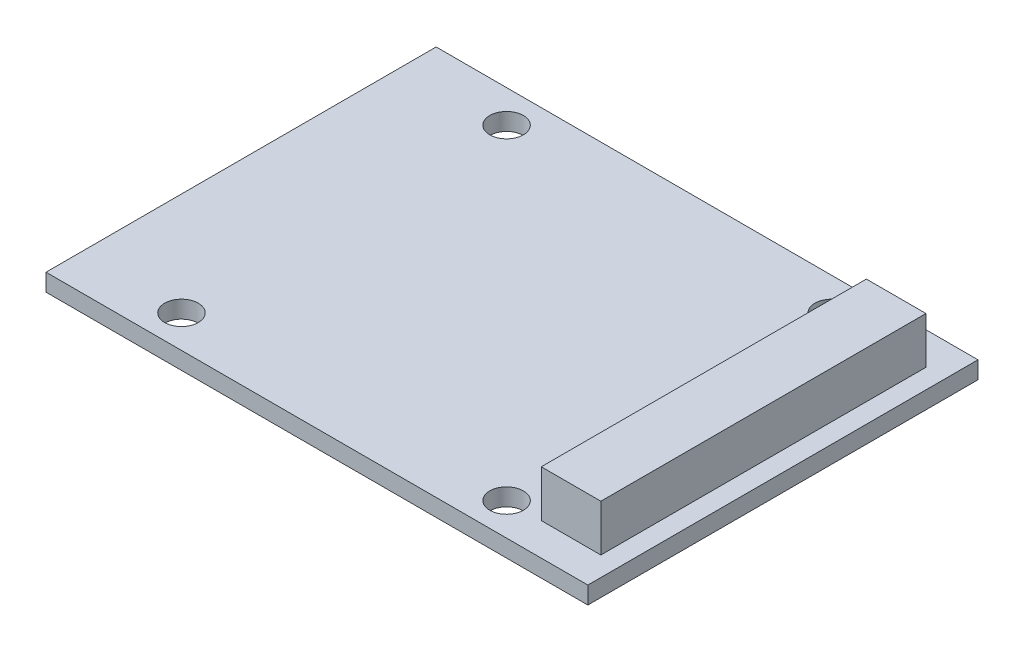
ISO-10303-21;
HEADER;
FILE_DESCRIPTION(('STEP AP214'),'2;1');
FILE_NAME('part.step','',(''),(''),'','','');
FILE_SCHEMA(('AUTOMOTIVE_DESIGN { 1 0 10303 214 1 1 1 1 }'));
ENDSEC;
DATA;
#1=APPLICATION_CONTEXT('core data for automotive mechanical design processes');
#2=APPLICATION_PROTOCOL_DEFINITION('international standard','automotive_design',2000,#1);
#3=PRODUCT_CONTEXT('',#1,'mechanical');
#4=PRODUCT('Part','Part','',(#3));
#5=PRODUCT_RELATED_PRODUCT_CATEGORY('part','',(#4));
#6=PRODUCT_DEFINITION_FORMATION('','',#4);
#7=PRODUCT_DEFINITION_CONTEXT('part definition',#1,'design');
#8=PRODUCT_DEFINITION('design','',#6,#7);
#9=PRODUCT_DEFINITION_SHAPE('','',#8);
#10=(LENGTH_UNIT() NAMED_UNIT(*) SI_UNIT(.MILLI.,.METRE.));
#11=(NAMED_UNIT(*) PLANE_ANGLE_UNIT() SI_UNIT($,.RADIAN.));
#12=(NAMED_UNIT(*) SI_UNIT($,.STERADIAN.) SOLID_ANGLE_UNIT());
#13=UNCERTAINTY_MEASURE_WITH_UNIT(LENGTH_MEASURE(1.E-05),#10,'distance_accuracy_value','');
#14=(GEOMETRIC_REPRESENTATION_CONTEXT(3) GLOBAL_UNCERTAINTY_ASSIGNED_CONTEXT((#13)) GLOBAL_UNIT_ASSIGNED_CONTEXT((#10,
#11,#12)) REPRESENTATION_CONTEXT('',''));
#15=CARTESIAN_POINT('',(0.,0.,0.));
#16=DIRECTION('',(0.,0.,1.));
#17=DIRECTION('',(1.,0.,0.));
#18=AXIS2_PLACEMENT_3D('',#15,#16,#17);
#19=CARTESIAN_POINT('',(0.,1.6,0.));
#20=DIRECTION('',(0.,-1.,0.));
#21=DIRECTION('',(0.,0.,-1.));
#22=AXIS2_PLACEMENT_3D('',#19,#20,#21);
#23=PLANE('',#22);
#24=CARTESIAN_POINT('',(14.5,1.6,15.));
#25=DIRECTION('',(0.,1.,0.));
#26=DIRECTION('',(0.,0.,-1.));
#27=AXIS2_PLACEMENT_3D('',#24,#25,#26);
#28=CIRCLE('',#27,1.55);
#29=CARTESIAN_POINT('',(14.5,1.6,13.45));
#30=VERTEX_POINT('',#29);
#31=EDGE_CURVE('E123',#30,#30,#28,.T.);
#32=ORIENTED_EDGE('',*,*,#31,.F.);
#33=EDGE_LOOP('',(#32));
#34=FACE_BOUND('',#33,.T.);
#35=CARTESIAN_POINT('',(-15.5,1.6,15.));
#36=DIRECTION('',(0.,1.,0.));
#37=DIRECTION('',(0.,0.,-1.));
#38=AXIS2_PLACEMENT_3D('',#35,#36,#37);
#39=CIRCLE('',#38,1.55);
#40=CARTESIAN_POINT('',(-15.5,1.6,13.45));
#41=VERTEX_POINT('',#40);
#42=EDGE_CURVE('E138',#41,#41,#39,.T.);
#43=ORIENTED_EDGE('',*,*,#42,.F.);
#44=EDGE_LOOP('',(#43));
#45=FACE_BOUND('',#44,.T.);
#46=DIRECTION('',(0.,0.,1.));
#47=VECTOR('',#46,1.);
#48=CARTESIAN_POINT('',(-25.,1.6,-18.));
#49=LINE('',#48,#47);
#50=CARTESIAN_POINT('',(-25.,1.6,-18.));
#51=VERTEX_POINT('',#50);
#52=CARTESIAN_POINT('',(-25.,1.6,18.));
#53=VERTEX_POINT('',#52);
#54=EDGE_CURVE('E150',#51,#53,#49,.T.);
#55=ORIENTED_EDGE('',*,*,#54,.T.);
#56=DIRECTION('',(1.,0.,0.));
#57=VECTOR('',#56,1.);
#58=CARTESIAN_POINT('',(25.,1.6,18.));
#59=LINE('',#58,#57);
#60=CARTESIAN_POINT('',(25.,1.6,18.));
#61=VERTEX_POINT('',#60);
#62=EDGE_CURVE('E153',#53,#61,#59,.T.);
#63=ORIENTED_EDGE('',*,*,#62,.T.);
#64=DIRECTION('',(0.,0.,-1.));
#65=VECTOR('',#64,1.);
#66=CARTESIAN_POINT('',(25.,1.6,-18.));
#67=LINE('',#66,#65);
#68=CARTESIAN_POINT('',(25.,1.6,-18.));
#69=VERTEX_POINT('',#68);
#70=EDGE_CURVE('E156',#61,#69,#67,.T.);
#71=ORIENTED_EDGE('',*,*,#70,.T.);
#72=DIRECTION('',(-1.,0.,0.));
#73=VECTOR('',#72,1.);
#74=CARTESIAN_POINT('',(25.,1.6,-18.));
#75=LINE('',#74,#73);
#76=EDGE_CURVE('E158',#69,#51,#75,.T.);
#77=ORIENTED_EDGE('',*,*,#76,.T.);
#78=EDGE_LOOP('',(#55,#63,#71,#77));
#79=FACE_BOUND('',#78,.T.);
#80=CARTESIAN_POINT('',(-15.5,1.6,-15.));
#81=DIRECTION('',(0.,1.,0.));
#82=DIRECTION('',(0.,0.,1.));
#83=AXIS2_PLACEMENT_3D('',#80,#81,#82);
#84=CIRCLE('',#83,1.55);
#85=CARTESIAN_POINT('',(-15.5,1.6,-13.45));
#86=VERTEX_POINT('',#85);
#87=EDGE_CURVE('E144',#86,#86,#84,.T.);
#88=ORIENTED_EDGE('',*,*,#87,.F.);
#89=EDGE_LOOP('',(#88));
#90=FACE_BOUND('',#89,.T.);
#91=CARTESIAN_POINT('',(14.5,1.6,-15.));
#92=DIRECTION('',(0.,1.,0.));
#93=DIRECTION('',(0.,0.,1.));
#94=AXIS2_PLACEMENT_3D('',#91,#92,#93);
#95=CIRCLE('',#94,1.55);
#96=CARTESIAN_POINT('',(14.5,1.6,-13.45));
#97=VERTEX_POINT('',#96);
#98=EDGE_CURVE('E132',#97,#97,#95,.T.);
#99=ORIENTED_EDGE('',*,*,#98,.F.);
#100=EDGE_LOOP('',(#99));
#101=FACE_BOUND('',#100,.T.);
#102=DIRECTION('',(0.,0.,-1.));
#103=VECTOR('',#102,1.);
#104=CARTESIAN_POINT('',(23.2,1.6,-15.));
#105=LINE('',#104,#103);
#106=CARTESIAN_POINT('',(23.2,1.6,15.));
#107=VERTEX_POINT('',#106);
#108=CARTESIAN_POINT('',(23.2,1.6,-15.));
#109=VERTEX_POINT('',#108);
#110=EDGE_CURVE('E119',#107,#109,#105,.T.);
#111=ORIENTED_EDGE('',*,*,#110,.F.);
#112=DIRECTION('',(1.,0.,0.));
#113=VECTOR('',#112,1.);
#114=CARTESIAN_POINT('',(23.2,1.6,15.));
#115=LINE('',#114,#113);
#116=CARTESIAN_POINT('',(17.7,1.6,15.));
#117=VERTEX_POINT('',#116);
#118=EDGE_CURVE('E116',#117,#107,#115,.T.);
#119=ORIENTED_EDGE('',*,*,#118,.F.);
#120=DIRECTION('',(0.,0.,1.));
#121=VECTOR('',#120,1.);
#122=CARTESIAN_POINT('',(17.7,1.6,-15.));
#123=LINE('',#122,#121);
#124=CARTESIAN_POINT('',(17.7,1.6,-15.));
#125=VERTEX_POINT('',#124);
#126=EDGE_CURVE('E54',#125,#117,#123,.T.);
#127=ORIENTED_EDGE('',*,*,#126,.F.);
#128=DIRECTION('',(-1.,0.,0.));
#129=VECTOR('',#128,1.);
#130=CARTESIAN_POINT('',(23.2,1.6,-15.));
#131=LINE('',#130,#129);
#132=EDGE_CURVE('E49',#109,#125,#131,.T.);
#133=ORIENTED_EDGE('',*,*,#132,.F.);
#134=EDGE_LOOP('',(#111,#119,#127,#133));
#135=FACE_BOUND('',#134,.T.);
#136=ADVANCED_FACE('F34',(#34,#45,#79,#90,#101,#135),#23,.F.);
#137=CARTESIAN_POINT('',(0.,0.,0.));
#138=DIRECTION('',(0.,-1.,0.));
#139=DIRECTION('',(0.,0.,-1.));
#140=AXIS2_PLACEMENT_3D('',#137,#138,#139);
#141=PLANE('',#140);
#142=CARTESIAN_POINT('',(14.5,0.,-15.));
#143=DIRECTION('',(0.,1.,0.));
#144=DIRECTION('',(0.,0.,1.));
#145=AXIS2_PLACEMENT_3D('',#142,#143,#144);
#146=CIRCLE('',#145,1.55);
#147=CARTESIAN_POINT('',(14.5,0.,-13.45));
#148=VERTEX_POINT('',#147);
#149=EDGE_CURVE('E130',#148,#148,#146,.T.);
#150=ORIENTED_EDGE('',*,*,#149,.T.);
#151=EDGE_LOOP('',(#150));
#152=FACE_BOUND('',#151,.T.);
#153=CARTESIAN_POINT('',(-15.5,0.,-15.));
#154=DIRECTION('',(0.,1.,0.));
#155=DIRECTION('',(0.,0.,1.));
#156=AXIS2_PLACEMENT_3D('',#153,#154,#155);
#157=CIRCLE('',#156,1.55);
#158=CARTESIAN_POINT('',(-15.5,0.,-13.45));
#159=VERTEX_POINT('',#158);
#160=EDGE_CURVE('E141',#159,#159,#157,.T.);
#161=ORIENTED_EDGE('',*,*,#160,.T.);
#162=EDGE_LOOP('',(#161));
#163=FACE_BOUND('',#162,.T.);
#164=DIRECTION('',(0.,0.,1.));
#165=VECTOR('',#164,1.);
#166=CARTESIAN_POINT('',(-25.,0.,-18.));
#167=LINE('',#166,#165);
#168=CARTESIAN_POINT('',(-25.,0.,-18.));
#169=VERTEX_POINT('',#168);
#170=CARTESIAN_POINT('',(-25.,0.,18.));
#171=VERTEX_POINT('',#170);
#172=EDGE_CURVE('E147',#169,#171,#167,.T.);
#173=ORIENTED_EDGE('',*,*,#172,.F.);
#174=DIRECTION('',(-1.,0.,0.));
#175=VECTOR('',#174,1.);
#176=CARTESIAN_POINT('',(25.,0.,-18.));
#177=LINE('',#176,#175);
#178=CARTESIAN_POINT('',(25.,0.,-18.));
#179=VERTEX_POINT('',#178);
#180=EDGE_CURVE('E154',#179,#169,#177,.T.);
#181=ORIENTED_EDGE('',*,*,#180,.F.);
#182=DIRECTION('',(0.,0.,-1.));
#183=VECTOR('',#182,1.);
#184=CARTESIAN_POINT('',(25.,0.,-18.));
#185=LINE('',#184,#183);
#186=CARTESIAN_POINT('',(25.,0.,18.));
#187=VERTEX_POINT('',#186);
#188=EDGE_CURVE('E165',#187,#179,#185,.T.);
#189=ORIENTED_EDGE('',*,*,#188,.F.);
#190=DIRECTION('',(1.,0.,0.));
#191=VECTOR('',#190,1.);
#192=CARTESIAN_POINT('',(25.,0.,18.));
#193=LINE('',#192,#191);
#194=EDGE_CURVE('E163',#171,#187,#193,.T.);
#195=ORIENTED_EDGE('',*,*,#194,.F.);
#196=EDGE_LOOP('',(#173,#181,#189,#195));
#197=FACE_BOUND('',#196,.T.);
#198=CARTESIAN_POINT('',(-15.5,0.,15.));
#199=DIRECTION('',(0.,1.,0.));
#200=DIRECTION('',(0.,0.,-1.));
#201=AXIS2_PLACEMENT_3D('',#198,#199,#200);
#202=CIRCLE('',#201,1.55);
#203=CARTESIAN_POINT('',(-15.5,0.,13.45));
#204=VERTEX_POINT('',#203);
#205=EDGE_CURVE('E135',#204,#204,#202,.T.);
#206=ORIENTED_EDGE('',*,*,#205,.T.);
#207=EDGE_LOOP('',(#206));
#208=FACE_BOUND('',#207,.T.);
#209=CARTESIAN_POINT('',(14.5,0.,15.));
#210=DIRECTION('',(0.,1.,0.));
#211=DIRECTION('',(0.,0.,-1.));
#212=AXIS2_PLACEMENT_3D('',#209,#210,#211);
#213=CIRCLE('',#212,1.55);
#214=CARTESIAN_POINT('',(14.5,0.,13.45));
#215=VERTEX_POINT('',#214);
#216=EDGE_CURVE('E120',#215,#215,#213,.T.);
#217=ORIENTED_EDGE('',*,*,#216,.T.);
#218=EDGE_LOOP('',(#217));
#219=FACE_BOUND('',#218,.T.);
#220=ADVANCED_FACE('F183',(#152,#163,#197,#208,#219),#141,.T.);
#221=CARTESIAN_POINT('',(-25.,1.6,-18.));
#222=DIRECTION('',(1.,0.,0.));
#223=DIRECTION('',(0.,0.,-1.));
#224=AXIS2_PLACEMENT_3D('',#221,#222,#223);
#225=PLANE('',#224);
#226=ORIENTED_EDGE('',*,*,#172,.T.);
#227=DIRECTION('',(0.,-1.,0.));
#228=VECTOR('',#227,1.);
#229=CARTESIAN_POINT('',(-25.,1.6,18.));
#230=LINE('',#229,#228);
#231=EDGE_CURVE('E11',#53,#171,#230,.T.);
#232=ORIENTED_EDGE('',*,*,#231,.F.);
#233=ORIENTED_EDGE('',*,*,#54,.F.);
#234=DIRECTION('',(0.,-1.,0.));
#235=VECTOR('',#234,1.);
#236=CARTESIAN_POINT('',(-25.,1.6,-18.));
#237=LINE('',#236,#235);
#238=EDGE_CURVE('E160',#51,#169,#237,.T.);
#239=ORIENTED_EDGE('',*,*,#238,.T.);
#240=EDGE_LOOP('',(#226,#232,#233,#239));
#241=FACE_BOUND('',#240,.T.);
#242=ADVANCED_FACE('F36',(#241),#225,.F.);
#243=CARTESIAN_POINT('',(25.,1.6,18.));
#244=DIRECTION('',(0.,0.,-1.));
#245=DIRECTION('',(-1.,0.,0.));
#246=AXIS2_PLACEMENT_3D('',#243,#244,#245);
#247=PLANE('',#246);
#248=ORIENTED_EDGE('',*,*,#194,.T.);
#249=DIRECTION('',(0.,-1.,0.));
#250=VECTOR('',#249,1.);
#251=CARTESIAN_POINT('',(25.,1.6,18.));
#252=LINE('',#251,#250);
#253=EDGE_CURVE('E42',#61,#187,#252,.T.);
#254=ORIENTED_EDGE('',*,*,#253,.F.);
#255=ORIENTED_EDGE('',*,*,#62,.F.);
#256=ORIENTED_EDGE('',*,*,#231,.T.);
#257=EDGE_LOOP('',(#248,#254,#255,#256));
#258=FACE_BOUND('',#257,.T.);
#259=ADVANCED_FACE('F194',(#258),#247,.F.);
#260=CARTESIAN_POINT('',(25.,1.6,-18.));
#261=DIRECTION('',(-1.,0.,0.));
#262=DIRECTION('',(0.,0.,1.));
#263=AXIS2_PLACEMENT_3D('',#260,#261,#262);
#264=PLANE('',#263);
#265=ORIENTED_EDGE('',*,*,#188,.T.);
#266=DIRECTION('',(0.,-1.,0.));
#267=VECTOR('',#266,1.);
#268=CARTESIAN_POINT('',(25.,1.6,-18.));
#269=LINE('',#268,#267);
#270=EDGE_CURVE('E170',#69,#179,#269,.T.);
#271=ORIENTED_EDGE('',*,*,#270,.F.);
#272=ORIENTED_EDGE('',*,*,#70,.F.);
#273=ORIENTED_EDGE('',*,*,#253,.T.);
#274=EDGE_LOOP('',(#265,#271,#272,#273));
#275=FACE_BOUND('',#274,.T.);
#276=ADVANCED_FACE('F177',(#275),#264,.F.);
#277=CARTESIAN_POINT('',(25.,1.6,-18.));
#278=DIRECTION('',(0.,0.,1.));
#279=DIRECTION('',(1.,0.,0.));
#280=AXIS2_PLACEMENT_3D('',#277,#278,#279);
#281=PLANE('',#280);
#282=ORIENTED_EDGE('',*,*,#180,.T.);
#283=ORIENTED_EDGE('',*,*,#238,.F.);
#284=ORIENTED_EDGE('',*,*,#76,.F.);
#285=ORIENTED_EDGE('',*,*,#270,.T.);
#286=EDGE_LOOP('',(#282,#283,#284,#285));
#287=FACE_BOUND('',#286,.T.);
#288=ADVANCED_FACE('F187',(#287),#281,.F.);
#289=CARTESIAN_POINT('',(-15.5,1.6,-15.));
#290=DIRECTION('',(0.,-1.,0.));
#291=DIRECTION('',(0.,0.,-1.));
#292=AXIS2_PLACEMENT_3D('',#289,#290,#291);
#293=CYLINDRICAL_SURFACE('',#292,1.55);
#294=ORIENTED_EDGE('',*,*,#87,.T.);
#295=EDGE_LOOP('',(#294));
#296=FACE_BOUND('',#295,.T.);
#297=ORIENTED_EDGE('',*,*,#160,.F.);
#298=EDGE_LOOP('',(#297));
#299=FACE_BOUND('',#298,.T.);
#300=ADVANCED_FACE('F212',(#296,#299),#293,.F.);
#301=CARTESIAN_POINT('',(-15.5,1.6,15.));
#302=DIRECTION('',(0.,-1.,0.));
#303=DIRECTION('',(0.,0.,-1.));
#304=AXIS2_PLACEMENT_3D('',#301,#302,#303);
#305=CYLINDRICAL_SURFACE('',#304,1.55);
#306=ORIENTED_EDGE('',*,*,#42,.T.);
#307=EDGE_LOOP('',(#306));
#308=FACE_BOUND('',#307,.T.);
#309=ORIENTED_EDGE('',*,*,#205,.F.);
#310=EDGE_LOOP('',(#309));
#311=FACE_BOUND('',#310,.T.);
#312=ADVANCED_FACE('F219',(#308,#311),#305,.F.);
#313=CARTESIAN_POINT('',(14.5,1.6,-15.));
#314=DIRECTION('',(0.,-1.,0.));
#315=DIRECTION('',(0.,0.,-1.));
#316=AXIS2_PLACEMENT_3D('',#313,#314,#315);
#317=CYLINDRICAL_SURFACE('',#316,1.55);
#318=ORIENTED_EDGE('',*,*,#98,.T.);
#319=EDGE_LOOP('',(#318));
#320=FACE_BOUND('',#319,.T.);
#321=ORIENTED_EDGE('',*,*,#149,.F.);
#322=EDGE_LOOP('',(#321));
#323=FACE_BOUND('',#322,.T.);
#324=ADVANCED_FACE('F224',(#320,#323),#317,.F.);
#325=CARTESIAN_POINT('',(14.5,1.6,15.));
#326=DIRECTION('',(0.,-1.,0.));
#327=DIRECTION('',(0.,0.,-1.));
#328=AXIS2_PLACEMENT_3D('',#325,#326,#327);
#329=CYLINDRICAL_SURFACE('',#328,1.55);
#330=ORIENTED_EDGE('',*,*,#31,.T.);
#331=EDGE_LOOP('',(#330));
#332=FACE_BOUND('',#331,.T.);
#333=ORIENTED_EDGE('',*,*,#216,.F.);
#334=EDGE_LOOP('',(#333));
#335=FACE_BOUND('',#334,.T.);
#336=ADVANCED_FACE('F259',(#332,#335),#329,.F.);
#337=CARTESIAN_POINT('',(23.2,5.9,-15.));
#338=DIRECTION('',(-1.,0.,0.));
#339=DIRECTION('',(0.,0.,1.));
#340=AXIS2_PLACEMENT_3D('',#337,#338,#339);
#341=PLANE('',#340);
#342=ORIENTED_EDGE('',*,*,#110,.T.);
#343=DIRECTION('',(0.,-1.,0.));
#344=VECTOR('',#343,1.);
#345=CARTESIAN_POINT('',(23.2,5.9,-15.));
#346=LINE('',#345,#344);
#347=CARTESIAN_POINT('',(23.2,5.9,-15.));
#348=VERTEX_POINT('',#347);
#349=EDGE_CURVE('E100',#348,#109,#346,.T.);
#350=ORIENTED_EDGE('',*,*,#349,.F.);
#351=DIRECTION('',(0.,0.,-1.));
#352=VECTOR('',#351,1.);
#353=CARTESIAN_POINT('',(23.2,5.9,-15.));
#354=LINE('',#353,#352);
#355=CARTESIAN_POINT('',(23.2,5.9,15.));
#356=VERTEX_POINT('',#355);
#357=EDGE_CURVE('E107',#356,#348,#354,.T.);
#358=ORIENTED_EDGE('',*,*,#357,.F.);
#359=DIRECTION('',(0.,-1.,0.));
#360=VECTOR('',#359,1.);
#361=CARTESIAN_POINT('',(23.2,5.9,15.));
#362=LINE('',#361,#360);
#363=EDGE_CURVE('E237',#356,#107,#362,.T.);
#364=ORIENTED_EDGE('',*,*,#363,.T.);
#365=EDGE_LOOP('',(#342,#350,#358,#364));
#366=FACE_BOUND('',#365,.T.);
#367=ADVANCED_FACE('F118',(#366),#341,.F.);
#368=CARTESIAN_POINT('',(23.2,5.9,-15.));
#369=DIRECTION('',(0.,0.,1.));
#370=DIRECTION('',(1.,0.,0.));
#371=AXIS2_PLACEMENT_3D('',#368,#369,#370);
#372=PLANE('',#371);
#373=ORIENTED_EDGE('',*,*,#132,.T.);
#374=DIRECTION('',(0.,-1.,0.));
#375=VECTOR('',#374,1.);
#376=CARTESIAN_POINT('',(17.7,5.9,-15.));
#377=LINE('',#376,#375);
#378=CARTESIAN_POINT('',(17.7,5.9,-15.));
#379=VERTEX_POINT('',#378);
#380=EDGE_CURVE('E103',#379,#125,#377,.T.);
#381=ORIENTED_EDGE('',*,*,#380,.F.);
#382=DIRECTION('',(-1.,0.,0.));
#383=VECTOR('',#382,1.);
#384=CARTESIAN_POINT('',(23.2,5.9,-15.));
#385=LINE('',#384,#383);
#386=EDGE_CURVE('E96',#348,#379,#385,.T.);
#387=ORIENTED_EDGE('',*,*,#386,.F.);
#388=ORIENTED_EDGE('',*,*,#349,.T.);
#389=EDGE_LOOP('',(#373,#381,#387,#388));
#390=FACE_BOUND('',#389,.T.);
#391=ADVANCED_FACE('F98',(#390),#372,.F.);
#392=CARTESIAN_POINT('',(17.7,5.9,-15.));
#393=DIRECTION('',(1.,0.,0.));
#394=DIRECTION('',(0.,0.,-1.));
#395=AXIS2_PLACEMENT_3D('',#392,#393,#394);
#396=PLANE('',#395);
#397=ORIENTED_EDGE('',*,*,#126,.T.);
#398=DIRECTION('',(0.,-1.,0.));
#399=VECTOR('',#398,1.);
#400=CARTESIAN_POINT('',(17.7,5.9,15.));
#401=LINE('',#400,#399);
#402=CARTESIAN_POINT('',(17.7,5.9,15.));
#403=VERTEX_POINT('',#402);
#404=EDGE_CURVE('E125',#403,#117,#401,.T.);
#405=ORIENTED_EDGE('',*,*,#404,.F.);
#406=DIRECTION('',(0.,0.,1.));
#407=VECTOR('',#406,1.);
#408=CARTESIAN_POINT('',(17.7,5.9,-15.));
#409=LINE('',#408,#407);
#410=EDGE_CURVE('E106',#379,#403,#409,.T.);
#411=ORIENTED_EDGE('',*,*,#410,.F.);
#412=ORIENTED_EDGE('',*,*,#380,.T.);
#413=EDGE_LOOP('',(#397,#405,#411,#412));
#414=FACE_BOUND('',#413,.T.);
#415=ADVANCED_FACE('F246',(#414),#396,.F.);
#416=CARTESIAN_POINT('',(23.2,5.9,15.));
#417=DIRECTION('',(0.,0.,-1.));
#418=DIRECTION('',(-1.,0.,0.));
#419=AXIS2_PLACEMENT_3D('',#416,#417,#418);
#420=PLANE('',#419);
#421=ORIENTED_EDGE('',*,*,#118,.T.);
#422=ORIENTED_EDGE('',*,*,#363,.F.);
#423=DIRECTION('',(1.,0.,0.));
#424=VECTOR('',#423,1.);
#425=CARTESIAN_POINT('',(23.2,5.9,15.));
#426=LINE('',#425,#424);
#427=EDGE_CURVE('E112',#403,#356,#426,.T.);
#428=ORIENTED_EDGE('',*,*,#427,.F.);
#429=ORIENTED_EDGE('',*,*,#404,.T.);
#430=EDGE_LOOP('',(#421,#422,#428,#429));
#431=FACE_BOUND('',#430,.T.);
#432=ADVANCED_FACE('F236',(#431),#420,.F.);
#433=CARTESIAN_POINT('',(0.,5.9,0.));
#434=DIRECTION('',(0.,-1.,0.));
#435=DIRECTION('',(0.,0.,-1.));
#436=AXIS2_PLACEMENT_3D('',#433,#434,#435);
#437=PLANE('',#436);
#438=ORIENTED_EDGE('',*,*,#357,.T.);
#439=ORIENTED_EDGE('',*,*,#386,.T.);
#440=ORIENTED_EDGE('',*,*,#410,.T.);
#441=ORIENTED_EDGE('',*,*,#427,.T.);
#442=EDGE_LOOP('',(#438,#439,#440,#441));
#443=FACE_BOUND('',#442,.T.);
#444=ADVANCED_FACE('F110',(#443),#437,.F.);
#445=CLOSED_SHELL('',(#136,#220,#242,#259,#276,#288,#300,#312,#324,#336,#367,#391,#415,#432,#444));
#446=MANIFOLD_SOLID_BREP('B2',#445);
#447=ADVANCED_BREP_SHAPE_REPRESENTATION('',(#18,#446),#14);
#448=SHAPE_DEFINITION_REPRESENTATION(#9,#447);
ENDSEC;
END-ISO-10303-21;
